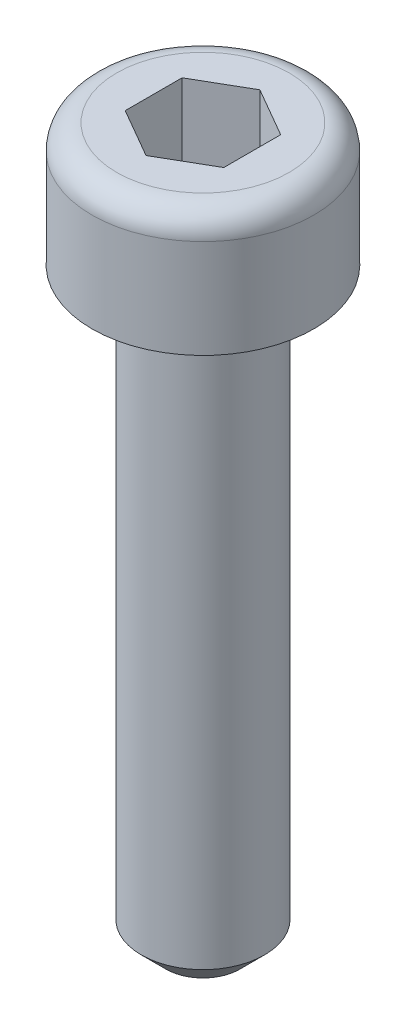
ISO-10303-21;
HEADER;
FILE_DESCRIPTION(('STEP AP214'),'2;1');
FILE_NAME('part.step','',(''),(''),'','','');
FILE_SCHEMA(('AUTOMOTIVE_DESIGN { 1 0 10303 214 1 1 1 1 }'));
ENDSEC;
DATA;
#1=APPLICATION_CONTEXT('core data for automotive mechanical design processes');
#2=APPLICATION_PROTOCOL_DEFINITION('international standard','automotive_design',2000,#1);
#3=PRODUCT_CONTEXT('',#1,'mechanical');
#4=PRODUCT('Part','Part','',(#3));
#5=PRODUCT_RELATED_PRODUCT_CATEGORY('part','',(#4));
#6=PRODUCT_DEFINITION_FORMATION('','',#4);
#7=PRODUCT_DEFINITION_CONTEXT('part definition',#1,'design');
#8=PRODUCT_DEFINITION('design','',#6,#7);
#9=PRODUCT_DEFINITION_SHAPE('','',#8);
#10=(LENGTH_UNIT() NAMED_UNIT(*) SI_UNIT(.MILLI.,.METRE.));
#11=(NAMED_UNIT(*) PLANE_ANGLE_UNIT() SI_UNIT($,.RADIAN.));
#12=(NAMED_UNIT(*) SI_UNIT($,.STERADIAN.) SOLID_ANGLE_UNIT());
#13=UNCERTAINTY_MEASURE_WITH_UNIT(LENGTH_MEASURE(1.E-05),#10,'distance_accuracy_value','');
#14=(GEOMETRIC_REPRESENTATION_CONTEXT(3) GLOBAL_UNCERTAINTY_ASSIGNED_CONTEXT((#13)) GLOBAL_UNIT_ASSIGNED_CONTEXT((#10,
#11,#12)) REPRESENTATION_CONTEXT('',''));
#15=CARTESIAN_POINT('',(0.,0.,0.));
#16=DIRECTION('',(0.,0.,1.));
#17=DIRECTION('',(1.,0.,0.));
#18=AXIS2_PLACEMENT_3D('',#15,#16,#17);
#19=CARTESIAN_POINT('',(0.,0.,0.));
#20=DIRECTION('',(0.,-1.,0.));
#21=DIRECTION('',(0.,0.,-1.));
#22=AXIS2_PLACEMENT_3D('',#19,#20,#21);
#23=PLANE('',#22);
#24=CARTESIAN_POINT('',(0.,0.,0.));
#25=DIRECTION('',(0.,-1.,0.));
#26=DIRECTION('',(0.,0.,-1.));
#27=AXIS2_PLACEMENT_3D('',#24,#25,#26);
#28=CIRCLE('',#27,1.75);
#29=CARTESIAN_POINT('',(0.,0.,-1.75));
#30=VERTEX_POINT('',#29);
#31=EDGE_CURVE('E43',#30,#30,#28,.F.);
#32=ORIENTED_EDGE('',*,*,#31,.T.);
#33=EDGE_LOOP('',(#32));
#34=FACE_BOUND('',#33,.T.);
#35=DIRECTION('',(-0.866025403784439,0.,-0.5));
#36=VECTOR('',#35,1.);
#37=CARTESIAN_POINT('',(1.,0.,-0.577350269189626));
#38=LINE('',#37,#36);
#39=CARTESIAN_POINT('',(1.,0.,-0.577350269189626));
#40=VERTEX_POINT('',#39);
#41=CARTESIAN_POINT('',(0.,0.,-1.15470053837925));
#42=VERTEX_POINT('',#41);
#43=EDGE_CURVE('E124',#40,#42,#38,.T.);
#44=ORIENTED_EDGE('',*,*,#43,.F.);
#45=DIRECTION('',(0.,0.,-1.));
#46=VECTOR('',#45,1.);
#47=CARTESIAN_POINT('',(1.,0.,0.577350269189626));
#48=LINE('',#47,#46);
#49=CARTESIAN_POINT('',(1.,0.,0.577350269189626));
#50=VERTEX_POINT('',#49);
#51=EDGE_CURVE('E50',#50,#40,#48,.T.);
#52=ORIENTED_EDGE('',*,*,#51,.F.);
#53=DIRECTION('',(0.866025403784439,0.,-0.5));
#54=VECTOR('',#53,1.);
#55=CARTESIAN_POINT('',(0.,0.,1.15470053837925));
#56=LINE('',#55,#54);
#57=CARTESIAN_POINT('',(0.,0.,1.15470053837925));
#58=VERTEX_POINT('',#57);
#59=EDGE_CURVE('E133',#58,#50,#56,.T.);
#60=ORIENTED_EDGE('',*,*,#59,.F.);
#61=DIRECTION('',(0.866025403784438,0.,0.5));
#62=VECTOR('',#61,1.);
#63=CARTESIAN_POINT('',(-0.999999999999999,0.,0.577350269189626));
#64=LINE('',#63,#62);
#65=CARTESIAN_POINT('',(-0.999999999999999,0.,0.577350269189626));
#66=VERTEX_POINT('',#65);
#67=EDGE_CURVE('E131',#66,#58,#64,.T.);
#68=ORIENTED_EDGE('',*,*,#67,.F.);
#69=DIRECTION('',(0.,0.,1.));
#70=VECTOR('',#69,1.);
#71=CARTESIAN_POINT('',(-0.999999999999999,0.,-0.577350269189626));
#72=LINE('',#71,#70);
#73=CARTESIAN_POINT('',(-0.999999999999999,0.,-0.577350269189626));
#74=VERTEX_POINT('',#73);
#75=EDGE_CURVE('E98',#74,#66,#72,.T.);
#76=ORIENTED_EDGE('',*,*,#75,.F.);
#77=DIRECTION('',(-0.866025403784439,0.,0.5));
#78=VECTOR('',#77,1.);
#79=CARTESIAN_POINT('',(0.,0.,-1.15470053837925));
#80=LINE('',#79,#78);
#81=EDGE_CURVE('E127',#42,#74,#80,.T.);
#82=ORIENTED_EDGE('',*,*,#81,.F.);
#83=EDGE_LOOP('',(#44,#52,#60,#68,#76,#82));
#84=FACE_BOUND('',#83,.T.);
#85=ADVANCED_FACE('F35',(#34,#84),#23,.F.);
#86=CARTESIAN_POINT('',(0.,0.,0.));
#87=DIRECTION('',(0.,1.,0.));
#88=DIRECTION('',(0.,0.,1.));
#89=AXIS2_PLACEMENT_3D('',#86,#87,#88);
#90=CYLINDRICAL_SURFACE('',#89,2.25);
#91=CARTESIAN_POINT('',(0.,-0.5,0.));
#92=DIRECTION('',(0.,-1.,0.));
#93=DIRECTION('',(0.,0.,-1.));
#94=AXIS2_PLACEMENT_3D('',#91,#92,#93);
#95=CIRCLE('',#94,2.25);
#96=CARTESIAN_POINT('',(0.,-0.5,-2.25));
#97=VERTEX_POINT('',#96);
#98=EDGE_CURVE('E11',#97,#97,#95,.T.);
#99=ORIENTED_EDGE('',*,*,#98,.T.);
#100=EDGE_LOOP('',(#99));
#101=FACE_BOUND('',#100,.T.);
#102=CARTESIAN_POINT('',(0.,-2.5,0.));
#103=DIRECTION('',(0.,1.,0.));
#104=DIRECTION('',(0.,0.,1.));
#105=AXIS2_PLACEMENT_3D('',#102,#103,#104);
#106=CIRCLE('',#105,2.25);
#107=CARTESIAN_POINT('',(0.,-2.5,2.25));
#108=VERTEX_POINT('',#107);
#109=EDGE_CURVE('E145',#108,#108,#106,.T.);
#110=ORIENTED_EDGE('',*,*,#109,.T.);
#111=EDGE_LOOP('',(#110));
#112=FACE_BOUND('',#111,.T.);
#113=ADVANCED_FACE('F167',(#101,#112),#90,.T.);
#114=CARTESIAN_POINT('',(2.25,-2.5,0.));
#115=DIRECTION('',(0.,1.,0.));
#116=DIRECTION('',(0.,0.,1.));
#117=AXIS2_PLACEMENT_3D('',#114,#115,#116);
#118=PLANE('',#117);
#119=ORIENTED_EDGE('',*,*,#109,.F.);
#120=EDGE_LOOP('',(#119));
#121=FACE_BOUND('',#120,.T.);
#122=CARTESIAN_POINT('',(0.,-2.5,0.));
#123=DIRECTION('',(0.,1.,0.));
#124=DIRECTION('',(0.,0.,1.));
#125=AXIS2_PLACEMENT_3D('',#122,#123,#124);
#126=CIRCLE('',#125,1.25);
#127=CARTESIAN_POINT('',(0.,-2.5,1.25));
#128=VERTEX_POINT('',#127);
#129=EDGE_CURVE('E137',#128,#128,#126,.T.);
#130=ORIENTED_EDGE('',*,*,#129,.T.);
#131=EDGE_LOOP('',(#130));
#132=FACE_BOUND('',#131,.T.);
#133=ADVANCED_FACE('F172',(#121,#132),#118,.F.);
#134=CARTESIAN_POINT('',(0.,0.,0.));
#135=DIRECTION('',(0.,1.,0.));
#136=DIRECTION('',(0.,0.,1.));
#137=AXIS2_PLACEMENT_3D('',#134,#135,#136);
#138=CYLINDRICAL_SURFACE('',#137,1.25);
#139=CARTESIAN_POINT('',(0.,-14.,0.));
#140=DIRECTION('',(0.,1.,0.));
#141=DIRECTION('',(0.,0.,1.));
#142=AXIS2_PLACEMENT_3D('',#139,#140,#141);
#143=CIRCLE('',#142,1.25);
#144=CARTESIAN_POINT('',(0.,-14.,1.25));
#145=VERTEX_POINT('',#144);
#146=EDGE_CURVE('E148',#145,#145,#143,.T.);
#147=ORIENTED_EDGE('',*,*,#146,.T.);
#148=EDGE_LOOP('',(#147));
#149=FACE_BOUND('',#148,.T.);
#150=ORIENTED_EDGE('',*,*,#129,.F.);
#151=EDGE_LOOP('',(#150));
#152=FACE_BOUND('',#151,.T.);
#153=ADVANCED_FACE('F178',(#149,#152),#138,.T.);
#154=CARTESIAN_POINT('',(1.25,-14.5,0.));
#155=DIRECTION('',(0.,1.,0.));
#156=DIRECTION('',(0.,0.,1.));
#157=AXIS2_PLACEMENT_3D('',#154,#155,#156);
#158=PLANE('',#157);
#159=CARTESIAN_POINT('',(0.,-14.5,0.));
#160=DIRECTION('',(0.,1.,0.));
#161=DIRECTION('',(0.,0.,1.));
#162=AXIS2_PLACEMENT_3D('',#159,#160,#161);
#163=CIRCLE('',#162,0.749999999999999);
#164=CARTESIAN_POINT('',(0.,-14.5,0.749999999999999));
#165=VERTEX_POINT('',#164);
#166=EDGE_CURVE('E151',#165,#165,#163,.F.);
#167=ORIENTED_EDGE('',*,*,#166,.T.);
#168=EDGE_LOOP('',(#167));
#169=FACE_BOUND('',#168,.T.);
#170=ADVANCED_FACE('F182',(#169),#158,.F.);
#171=CARTESIAN_POINT('',(1.,-2.,0.577350269189626));
#172=DIRECTION('',(1.,0.,0.));
#173=DIRECTION('',(0.,0.,-1.));
#174=AXIS2_PLACEMENT_3D('',#171,#172,#173);
#175=PLANE('',#174);
#176=ORIENTED_EDGE('',*,*,#51,.T.);
#177=DIRECTION('',(0.,1.,0.));
#178=VECTOR('',#177,1.);
#179=CARTESIAN_POINT('',(1.,-2.,-0.577350269189626));
#180=LINE('',#179,#178);
#181=CARTESIAN_POINT('',(1.,-2.,-0.577350269189626));
#182=VERTEX_POINT('',#181);
#183=EDGE_CURVE('E80',#182,#40,#180,.T.);
#184=ORIENTED_EDGE('',*,*,#183,.F.);
#185=DIRECTION('',(0.,0.,-1.));
#186=VECTOR('',#185,1.);
#187=CARTESIAN_POINT('',(1.,-2.,0.577350269189626));
#188=LINE('',#187,#186);
#189=CARTESIAN_POINT('',(1.,-2.,0.577350269189626));
#190=VERTEX_POINT('',#189);
#191=EDGE_CURVE('E135',#190,#182,#188,.T.);
#192=ORIENTED_EDGE('',*,*,#191,.F.);
#193=DIRECTION('',(0.,1.,0.));
#194=VECTOR('',#193,1.);
#195=CARTESIAN_POINT('',(1.,-2.,0.577350269189626));
#196=LINE('',#195,#194);
#197=EDGE_CURVE('E58',#190,#50,#196,.T.);
#198=ORIENTED_EDGE('',*,*,#197,.T.);
#199=EDGE_LOOP('',(#176,#184,#192,#198));
#200=FACE_BOUND('',#199,.T.);
#201=ADVANCED_FACE('F186',(#200),#175,.F.);
#202=CARTESIAN_POINT('',(0.,-2.,1.15470053837925));
#203=DIRECTION('',(0.5,0.,0.866025403784439));
#204=DIRECTION('',(0.866025403784439,0.,-0.5));
#205=AXIS2_PLACEMENT_3D('',#202,#203,#204);
#206=PLANE('',#205);
#207=ORIENTED_EDGE('',*,*,#59,.T.);
#208=ORIENTED_EDGE('',*,*,#197,.F.);
#209=DIRECTION('',(0.866025403784439,0.,-0.5));
#210=VECTOR('',#209,1.);
#211=CARTESIAN_POINT('',(0.,-2.,1.15470053837925));
#212=LINE('',#211,#210);
#213=CARTESIAN_POINT('',(0.,-2.,1.15470053837925));
#214=VERTEX_POINT('',#213);
#215=EDGE_CURVE('E110',#214,#190,#212,.T.);
#216=ORIENTED_EDGE('',*,*,#215,.F.);
#217=DIRECTION('',(0.,1.,0.));
#218=VECTOR('',#217,1.);
#219=CARTESIAN_POINT('',(0.,-2.,1.15470053837925));
#220=LINE('',#219,#218);
#221=EDGE_CURVE('E102',#214,#58,#220,.T.);
#222=ORIENTED_EDGE('',*,*,#221,.T.);
#223=EDGE_LOOP('',(#207,#208,#216,#222));
#224=FACE_BOUND('',#223,.T.);
#225=ADVANCED_FACE('F190',(#224),#206,.F.);
#226=CARTESIAN_POINT('',(-0.999999999999999,-2.,0.577350269189626));
#227=DIRECTION('',(-0.5,0.,0.866025403784439));
#228=DIRECTION('',(0.866025403784438,0.,0.5));
#229=AXIS2_PLACEMENT_3D('',#226,#227,#228);
#230=PLANE('',#229);
#231=ORIENTED_EDGE('',*,*,#67,.T.);
#232=ORIENTED_EDGE('',*,*,#221,.F.);
#233=DIRECTION('',(0.866025403784438,0.,0.5));
#234=VECTOR('',#233,1.);
#235=CARTESIAN_POINT('',(-0.999999999999999,-2.,0.577350269189626));
#236=LINE('',#235,#234);
#237=CARTESIAN_POINT('',(-0.999999999999999,-2.,0.577350269189626));
#238=VERTEX_POINT('',#237);
#239=EDGE_CURVE('E106',#238,#214,#236,.T.);
#240=ORIENTED_EDGE('',*,*,#239,.F.);
#241=DIRECTION('',(0.,1.,0.));
#242=VECTOR('',#241,1.);
#243=CARTESIAN_POINT('',(-0.999999999999999,-2.,0.577350269189626));
#244=LINE('',#243,#242);
#245=EDGE_CURVE('E91',#238,#66,#244,.T.);
#246=ORIENTED_EDGE('',*,*,#245,.T.);
#247=EDGE_LOOP('',(#231,#232,#240,#246));
#248=FACE_BOUND('',#247,.T.);
#249=ADVANCED_FACE('F107',(#248),#230,.F.);
#250=CARTESIAN_POINT('',(-0.999999999999999,-2.,-0.577350269189626));
#251=DIRECTION('',(-1.,0.,0.));
#252=DIRECTION('',(0.,0.,1.));
#253=AXIS2_PLACEMENT_3D('',#250,#251,#252);
#254=PLANE('',#253);
#255=ORIENTED_EDGE('',*,*,#75,.T.);
#256=ORIENTED_EDGE('',*,*,#245,.F.);
#257=DIRECTION('',(0.,0.,1.));
#258=VECTOR('',#257,1.);
#259=CARTESIAN_POINT('',(-0.999999999999999,-2.,-0.577350269189626));
#260=LINE('',#259,#258);
#261=CARTESIAN_POINT('',(-0.999999999999999,-2.,-0.577350269189626));
#262=VERTEX_POINT('',#261);
#263=EDGE_CURVE('E95',#262,#238,#260,.T.);
#264=ORIENTED_EDGE('',*,*,#263,.F.);
#265=DIRECTION('',(0.,1.,0.));
#266=VECTOR('',#265,1.);
#267=CARTESIAN_POINT('',(-0.999999999999999,-2.,-0.577350269189626));
#268=LINE('',#267,#266);
#269=EDGE_CURVE('E103',#262,#74,#268,.T.);
#270=ORIENTED_EDGE('',*,*,#269,.T.);
#271=EDGE_LOOP('',(#255,#256,#264,#270));
#272=FACE_BOUND('',#271,.T.);
#273=ADVANCED_FACE('F93',(#272),#254,.F.);
#274=CARTESIAN_POINT('',(0.,-2.,-1.15470053837925));
#275=DIRECTION('',(-0.5,0.,-0.866025403784439));
#276=DIRECTION('',(-0.866025403784439,0.,0.5));
#277=AXIS2_PLACEMENT_3D('',#274,#275,#276);
#278=PLANE('',#277);
#279=ORIENTED_EDGE('',*,*,#81,.T.);
#280=ORIENTED_EDGE('',*,*,#269,.F.);
#281=DIRECTION('',(-0.866025403784439,0.,0.5));
#282=VECTOR('',#281,1.);
#283=CARTESIAN_POINT('',(0.,-2.,-1.15470053837925));
#284=LINE('',#283,#282);
#285=CARTESIAN_POINT('',(0.,-2.,-1.15470053837925));
#286=VERTEX_POINT('',#285);
#287=EDGE_CURVE('E116',#286,#262,#284,.T.);
#288=ORIENTED_EDGE('',*,*,#287,.F.);
#289=DIRECTION('',(0.,1.,0.));
#290=VECTOR('',#289,1.);
#291=CARTESIAN_POINT('',(0.,-2.,-1.15470053837925));
#292=LINE('',#291,#290);
#293=EDGE_CURVE('E140',#286,#42,#292,.T.);
#294=ORIENTED_EDGE('',*,*,#293,.T.);
#295=EDGE_LOOP('',(#279,#280,#288,#294));
#296=FACE_BOUND('',#295,.T.);
#297=ADVANCED_FACE('F194',(#296),#278,.F.);
#298=CARTESIAN_POINT('',(1.,-2.,-0.577350269189626));
#299=DIRECTION('',(0.5,0.,-0.866025403784439));
#300=DIRECTION('',(-0.866025403784439,0.,-0.5));
#301=AXIS2_PLACEMENT_3D('',#298,#299,#300);
#302=PLANE('',#301);
#303=ORIENTED_EDGE('',*,*,#43,.T.);
#304=ORIENTED_EDGE('',*,*,#293,.F.);
#305=DIRECTION('',(-0.866025403784439,0.,-0.5));
#306=VECTOR('',#305,1.);
#307=CARTESIAN_POINT('',(1.,-2.,-0.577350269189626));
#308=LINE('',#307,#306);
#309=EDGE_CURVE('E118',#182,#286,#308,.T.);
#310=ORIENTED_EDGE('',*,*,#309,.F.);
#311=ORIENTED_EDGE('',*,*,#183,.T.);
#312=EDGE_LOOP('',(#303,#304,#310,#311));
#313=FACE_BOUND('',#312,.T.);
#314=ADVANCED_FACE('F191',(#313),#302,.F.);
#315=CARTESIAN_POINT('',(1.,-2.,-0.577350269189626));
#316=DIRECTION('',(0.,1.,0.));
#317=DIRECTION('',(0.,0.,1.));
#318=AXIS2_PLACEMENT_3D('',#315,#316,#317);
#319=PLANE('',#318);
#320=ORIENTED_EDGE('',*,*,#191,.T.);
#321=ORIENTED_EDGE('',*,*,#309,.T.);
#322=ORIENTED_EDGE('',*,*,#287,.T.);
#323=ORIENTED_EDGE('',*,*,#263,.T.);
#324=ORIENTED_EDGE('',*,*,#239,.T.);
#325=ORIENTED_EDGE('',*,*,#215,.T.);
#326=EDGE_LOOP('',(#320,#321,#322,#323,#324,#325));
#327=FACE_BOUND('',#326,.T.);
#328=ADVANCED_FACE('F113',(#327),#319,.T.);
#329=CARTESIAN_POINT('',(0.,-14.,0.));
#330=DIRECTION('',(0.,1.,0.));
#331=DIRECTION('',(0.,0.,1.));
#332=AXIS2_PLACEMENT_3D('',#329,#330,#331);
#333=CONICAL_SURFACE('',#332,1.25,0.785398163397452);
#334=ORIENTED_EDGE('',*,*,#166,.F.);
#335=EDGE_LOOP('',(#334));
#336=FACE_BOUND('',#335,.T.);
#337=ORIENTED_EDGE('',*,*,#146,.F.);
#338=EDGE_LOOP('',(#337));
#339=FACE_BOUND('',#338,.T.);
#340=ADVANCED_FACE('F159',(#336,#339),#333,.T.);
#341=CARTESIAN_POINT('',(0.,-0.5,0.));
#342=DIRECTION('',(0.,-1.,0.));
#343=DIRECTION('',(0.,0.,-1.));
#344=AXIS2_PLACEMENT_3D('',#341,#342,#343);
#345=TOROIDAL_SURFACE('',#344,1.75,0.5);
#346=ORIENTED_EDGE('',*,*,#98,.F.);
#347=EDGE_LOOP('',(#346));
#348=FACE_BOUND('',#347,.T.);
#349=ORIENTED_EDGE('',*,*,#31,.F.);
#350=EDGE_LOOP('',(#349));
#351=FACE_BOUND('',#350,.T.);
#352=ADVANCED_FACE('F37',(#348,#351),#345,.T.);
#353=CLOSED_SHELL('',(#85,#113,#133,#153,#170,#201,#225,#249,#273,#297,#314,#328,#340,#352));
#354=MANIFOLD_SOLID_BREP('B2',#353);
#355=ADVANCED_BREP_SHAPE_REPRESENTATION('',(#18,#354),#14);
#356=SHAPE_DEFINITION_REPRESENTATION(#9,#355);
ENDSEC;
END-ISO-10303-21;
